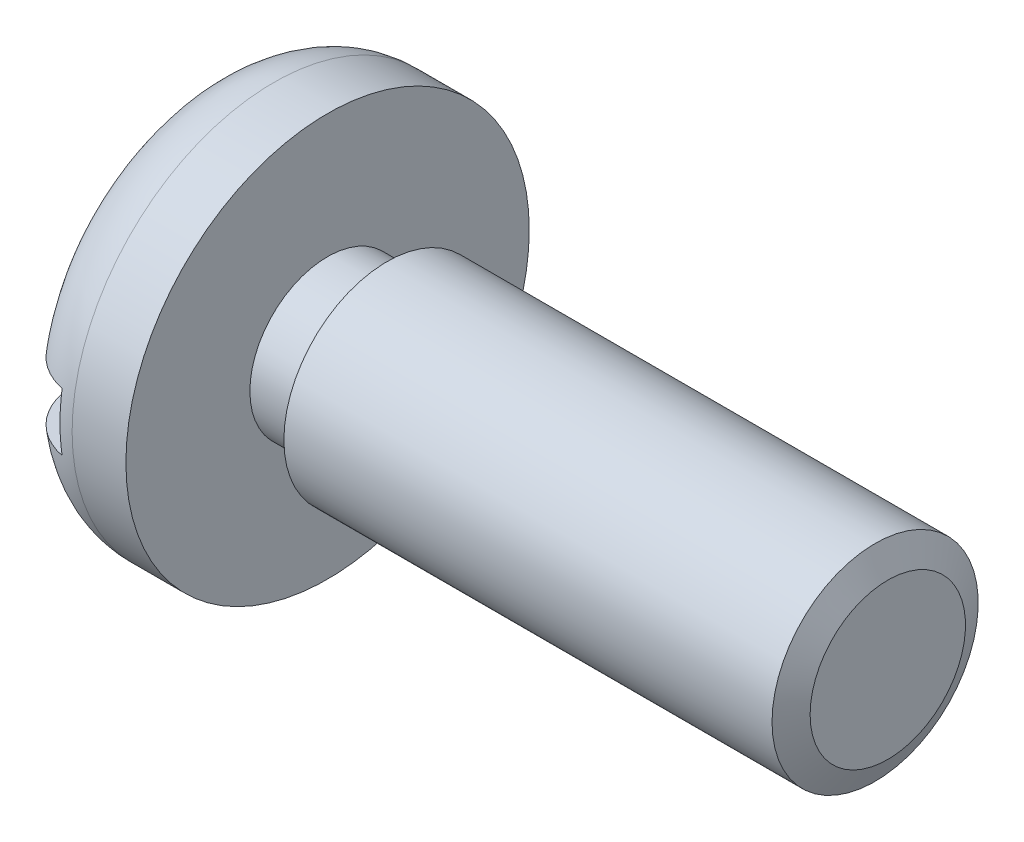
ISO-10303-21;
HEADER;
FILE_DESCRIPTION(('STEP AP214'),'2;1');
FILE_NAME('part.step','',(''),(''),'','','');
FILE_SCHEMA(('AUTOMOTIVE_DESIGN { 1 0 10303 214 1 1 1 1 }'));
ENDSEC;
DATA;
#1=APPLICATION_CONTEXT('core data for automotive mechanical design processes');
#2=APPLICATION_PROTOCOL_DEFINITION('international standard','automotive_design',2000,#1);
#3=PRODUCT_CONTEXT('',#1,'mechanical');
#4=PRODUCT('Part','Part','',(#3));
#5=PRODUCT_RELATED_PRODUCT_CATEGORY('part','',(#4));
#6=PRODUCT_DEFINITION_FORMATION('','',#4);
#7=PRODUCT_DEFINITION_CONTEXT('part definition',#1,'design');
#8=PRODUCT_DEFINITION('design','',#6,#7);
#9=PRODUCT_DEFINITION_SHAPE('','',#8);
#10=(LENGTH_UNIT() NAMED_UNIT(*) SI_UNIT(.MILLI.,.METRE.));
#11=(NAMED_UNIT(*) PLANE_ANGLE_UNIT() SI_UNIT($,.RADIAN.));
#12=(NAMED_UNIT(*) SI_UNIT($,.STERADIAN.) SOLID_ANGLE_UNIT());
#13=UNCERTAINTY_MEASURE_WITH_UNIT(LENGTH_MEASURE(1.E-05),#10,'distance_accuracy_value','');
#14=(GEOMETRIC_REPRESENTATION_CONTEXT(3) GLOBAL_UNCERTAINTY_ASSIGNED_CONTEXT((#13)) GLOBAL_UNIT_ASSIGNED_CONTEXT((#10,
#11,#12)) REPRESENTATION_CONTEXT('',''));
#15=CARTESIAN_POINT('',(0.,0.,0.));
#16=DIRECTION('',(0.,0.,1.));
#17=DIRECTION('',(1.,0.,0.));
#18=AXIS2_PLACEMENT_3D('',#15,#16,#17);
#19=CARTESIAN_POINT('',(-2.0828,2.2606,0.));
#20=DIRECTION('',(1.,0.,0.));
#21=DIRECTION('',(0.,0.,-1.));
#22=AXIS2_PLACEMENT_3D('',#19,#20,#21);
#23=PLANE('',#22);
#24=CARTESIAN_POINT('',(-2.0828,0.,0.));
#25=DIRECTION('',(-1.,0.,0.));
#26=DIRECTION('',(0.,0.,1.));
#27=AXIS2_PLACEMENT_3D('',#24,#25,#26);
#28=CIRCLE('',#27,2.2606);
#29=CARTESIAN_POINT('',(-2.0828,-0.4953,-2.20567229433567));
#30=VERTEX_POINT('',#29);
#31=CARTESIAN_POINT('',(-2.0828,-0.4953,2.20567229433567));
#32=VERTEX_POINT('',#31);
#33=EDGE_CURVE('E138',#30,#32,#28,.T.);
#34=ORIENTED_EDGE('',*,*,#33,.T.);
#35=DIRECTION('',(0.,0.,-1.));
#36=VECTOR('',#35,1.);
#37=CARTESIAN_POINT('',(-2.0828,-0.4953,0.));
#38=LINE('',#37,#36);
#39=EDGE_CURVE('E139',#32,#30,#38,.T.);
#40=ORIENTED_EDGE('',*,*,#39,.T.);
#41=EDGE_LOOP('',(#34,#40));
#42=FACE_BOUND('',#41,.T.);
#43=ADVANCED_FACE('F16',(#42),#23,.F.);
#44=CARTESIAN_POINT('',(-2.0828,0.4953,2.20567229433567));
#45=VERTEX_POINT('',#44);
#46=CARTESIAN_POINT('',(-2.0828,0.4953,-2.20567229433567));
#47=VERTEX_POINT('',#46);
#48=EDGE_CURVE('E83',#45,#47,#28,.T.);
#49=ORIENTED_EDGE('',*,*,#48,.T.);
#50=DIRECTION('',(0.,0.,1.));
#51=VECTOR('',#50,1.);
#52=CARTESIAN_POINT('',(-2.0828,0.4953,0.));
#53=LINE('',#52,#51);
#54=EDGE_CURVE('E77',#47,#45,#53,.T.);
#55=ORIENTED_EDGE('',*,*,#54,.T.);
#56=EDGE_LOOP('',(#49,#55));
#57=FACE_BOUND('',#56,.T.);
#58=ADVANCED_FACE('F18',(#57),#23,.F.);
#59=CARTESIAN_POINT('',(9.525,0.,0.));
#60=DIRECTION('',(-1.,0.,0.));
#61=DIRECTION('',(0.,0.,1.));
#62=AXIS2_PLACEMENT_3D('',#59,#60,#61);
#63=PLANE('',#62);
#64=CARTESIAN_POINT('',(9.525,0.,0.));
#65=DIRECTION('',(-1.,0.,0.));
#66=DIRECTION('',(0.,0.,1.));
#67=AXIS2_PLACEMENT_3D('',#64,#65,#66);
#68=CIRCLE('',#67,1.3208);
#69=CARTESIAN_POINT('',(9.525,0.,1.3208));
#70=VERTEX_POINT('',#69);
#71=EDGE_CURVE('E108',#70,#70,#68,.T.);
#72=ORIENTED_EDGE('',*,*,#71,.F.);
#73=EDGE_LOOP('',(#72));
#74=FACE_BOUND('',#73,.T.);
#75=ADVANCED_FACE('F249',(#74),#63,.F.);
#76=CARTESIAN_POINT('',(9.525,0.,0.));
#77=DIRECTION('',(-1.,0.,0.));
#78=DIRECTION('',(0.,0.,1.));
#79=AXIS2_PLACEMENT_3D('',#76,#77,#78);
#80=CONICAL_SURFACE('',#79,1.3208,1.10714871779409);
#81=CARTESIAN_POINT('',(9.3091,0.,0.));
#82=DIRECTION('',(-1.,0.,0.));
#83=DIRECTION('',(0.,0.,1.));
#84=AXIS2_PLACEMENT_3D('',#81,#82,#83);
#85=CIRCLE('',#84,1.7526);
#86=CARTESIAN_POINT('',(9.3091,0.,1.7526));
#87=VERTEX_POINT('',#86);
#88=EDGE_CURVE('E112',#87,#87,#85,.T.);
#89=ORIENTED_EDGE('',*,*,#88,.F.);
#90=EDGE_LOOP('',(#89));
#91=FACE_BOUND('',#90,.T.);
#92=ORIENTED_EDGE('',*,*,#71,.T.);
#93=EDGE_LOOP('',(#92));
#94=FACE_BOUND('',#93,.T.);
#95=ADVANCED_FACE('F238',(#91,#94),#80,.T.);
#96=CARTESIAN_POINT('',(-2.0828,0.,0.));
#97=DIRECTION('',(-1.,0.,0.));
#98=DIRECTION('',(0.,0.,1.));
#99=AXIS2_PLACEMENT_3D('',#96,#97,#98);
#100=CYLINDRICAL_SURFACE('',#99,1.7526);
#101=CARTESIAN_POINT('',(1.00965,0.,0.));
#102=DIRECTION('',(-1.,0.,0.));
#103=DIRECTION('',(0.,0.,1.));
#104=AXIS2_PLACEMENT_3D('',#101,#102,#103);
#105=CIRCLE('',#104,1.7526);
#106=CARTESIAN_POINT('',(1.00965,0.,1.7526));
#107=VERTEX_POINT('',#106);
#108=EDGE_CURVE('E116',#107,#107,#105,.T.);
#109=ORIENTED_EDGE('',*,*,#108,.F.);
#110=EDGE_LOOP('',(#109));
#111=FACE_BOUND('',#110,.T.);
#112=ORIENTED_EDGE('',*,*,#88,.T.);
#113=EDGE_LOOP('',(#112));
#114=FACE_BOUND('',#113,.T.);
#115=ADVANCED_FACE('F227',(#111,#114),#100,.T.);
#116=CARTESIAN_POINT('',(1.00965,0.,0.));
#117=DIRECTION('',(1.,0.,0.));
#118=DIRECTION('',(0.,0.,-1.));
#119=AXIS2_PLACEMENT_3D('',#116,#117,#118);
#120=CONICAL_SURFACE('',#119,1.7526,1.10714871779409);
#121=CARTESIAN_POINT('',(0.79375,0.,0.));
#122=DIRECTION('',(-1.,0.,0.));
#123=DIRECTION('',(0.,0.,1.));
#124=AXIS2_PLACEMENT_3D('',#121,#122,#123);
#125=CIRCLE('',#124,1.3208);
#126=CARTESIAN_POINT('',(0.79375,0.,1.3208));
#127=VERTEX_POINT('',#126);
#128=EDGE_CURVE('E120',#127,#127,#125,.T.);
#129=ORIENTED_EDGE('',*,*,#128,.F.);
#130=EDGE_LOOP('',(#129));
#131=FACE_BOUND('',#130,.T.);
#132=ORIENTED_EDGE('',*,*,#108,.T.);
#133=EDGE_LOOP('',(#132));
#134=FACE_BOUND('',#133,.T.);
#135=ADVANCED_FACE('F216',(#131,#134),#120,.T.);
#136=CARTESIAN_POINT('',(-2.0828,0.,0.));
#137=DIRECTION('',(-1.,0.,0.));
#138=DIRECTION('',(0.,0.,1.));
#139=AXIS2_PLACEMENT_3D('',#136,#137,#138);
#140=CYLINDRICAL_SURFACE('',#139,1.3208);
#141=CARTESIAN_POINT('',(0.,0.,0.));
#142=DIRECTION('',(-1.,0.,0.));
#143=DIRECTION('',(0.,0.,1.));
#144=AXIS2_PLACEMENT_3D('',#141,#142,#143);
#145=CIRCLE('',#144,1.3208);
#146=CARTESIAN_POINT('',(0.,0.,1.3208));
#147=VERTEX_POINT('',#146);
#148=EDGE_CURVE('E124',#147,#147,#145,.T.);
#149=ORIENTED_EDGE('',*,*,#148,.F.);
#150=EDGE_LOOP('',(#149));
#151=FACE_BOUND('',#150,.T.);
#152=ORIENTED_EDGE('',*,*,#128,.T.);
#153=EDGE_LOOP('',(#152));
#154=FACE_BOUND('',#153,.T.);
#155=ADVANCED_FACE('F205',(#151,#154),#140,.T.);
#156=CARTESIAN_POINT('',(0.,1.3208,0.));
#157=DIRECTION('',(-1.,0.,0.));
#158=DIRECTION('',(0.,0.,1.));
#159=AXIS2_PLACEMENT_3D('',#156,#157,#158);
#160=PLANE('',#159);
#161=CARTESIAN_POINT('',(0.,0.,0.));
#162=DIRECTION('',(-1.,0.,0.));
#163=DIRECTION('',(0.,0.,1.));
#164=AXIS2_PLACEMENT_3D('',#161,#162,#163);
#165=CIRCLE('',#164,3.429);
#166=CARTESIAN_POINT('',(0.,0.,3.429));
#167=VERTEX_POINT('',#166);
#168=EDGE_CURVE('E128',#167,#167,#165,.T.);
#169=ORIENTED_EDGE('',*,*,#168,.F.);
#170=EDGE_LOOP('',(#169));
#171=FACE_BOUND('',#170,.T.);
#172=ORIENTED_EDGE('',*,*,#148,.T.);
#173=EDGE_LOOP('',(#172));
#174=FACE_BOUND('',#173,.T.);
#175=ADVANCED_FACE('F195',(#171,#174),#160,.F.);
#176=CARTESIAN_POINT('',(-2.0828,0.,0.));
#177=DIRECTION('',(-1.,0.,0.));
#178=DIRECTION('',(0.,0.,1.));
#179=AXIS2_PLACEMENT_3D('',#176,#177,#178);
#180=CYLINDRICAL_SURFACE('',#179,3.429);
#181=CARTESIAN_POINT('',(-0.9144,0.,0.));
#182=DIRECTION('',(-1.,0.,0.));
#183=DIRECTION('',(0.,0.,1.));
#184=AXIS2_PLACEMENT_3D('',#181,#182,#183);
#185=CIRCLE('',#184,3.429);
#186=CARTESIAN_POINT('',(-0.9144,0.,3.429));
#187=VERTEX_POINT('',#186);
#188=EDGE_CURVE('E132',#187,#187,#185,.T.);
#189=ORIENTED_EDGE('',*,*,#188,.F.);
#190=EDGE_LOOP('',(#189));
#191=FACE_BOUND('',#190,.T.);
#192=ORIENTED_EDGE('',*,*,#168,.T.);
#193=EDGE_LOOP('',(#192));
#194=FACE_BOUND('',#193,.T.);
#195=ADVANCED_FACE('F186',(#191,#194),#180,.T.);
#196=CARTESIAN_POINT('',(-0.9144,0.,0.));
#197=DIRECTION('',(-1.,0.,0.));
#198=DIRECTION('',(0.,0.,1.));
#199=AXIS2_PLACEMENT_3D('',#196,#197,#198);
#200=TOROIDAL_SURFACE('',#199,2.2606,1.1684);
#201=CARTESIAN_POINT('',(-1.143,0.,0.));
#202=DIRECTION('',(1.,0.,0.));
#203=DIRECTION('',(0.,0.,-1.));
#204=AXIS2_PLACEMENT_3D('',#201,#202,#203);
#205=CIRCLE('',#204,3.40641874657382);
#206=CARTESIAN_POINT('',(-1.143,0.4953,3.37021758748743));
#207=VERTEX_POINT('',#206);
#208=CARTESIAN_POINT('',(-1.143,-0.4953,3.37021758748743));
#209=VERTEX_POINT('',#208);
#210=EDGE_CURVE('E62',#207,#209,#205,.T.);
#211=ORIENTED_EDGE('',*,*,#210,.T.);
#212=CARTESIAN_POINT('',(-1.25865842966259,-0.4953,1.03129456883617));
#213=CARTESIAN_POINT('',(-1.20231785172398,-0.4953,1.01202627526437));
#214=CARTESIAN_POINT('',(-1.14439336273882,-0.4953,0.99730839354669));
#215=CARTESIAN_POINT('',(-1.0268782932624,-0.4953,0.977833237836091));
#216=CARTESIAN_POINT('',(-0.967287663932715,-0.4953,0.973076256130951));
#217=CARTESIAN_POINT('',(-0.848148266979716,-0.4953,0.9738397546922));
#218=CARTESIAN_POINT('',(-0.788599524513452,-0.4953,0.979364216756958));
#219=CARTESIAN_POINT('',(-0.671279325053592,-0.4953,1.00033352543222));
#220=CARTESIAN_POINT('',(-0.613508401288207,-0.4953,1.01578131857541));
#221=CARTESIAN_POINT('',(-0.50106897853174,-0.4953,1.05577705679958));
#222=CARTESIAN_POINT('',(-0.446408830836591,-0.4953,1.08034827793362));
#223=CARTESIAN_POINT('',(-0.341475334021524,-0.4953,1.137522946039));
#224=CARTESIAN_POINT('',(-0.291203410896383,-0.4953,1.17012899093981));
#225=CARTESIAN_POINT('',(-0.191386732194814,-0.4953,1.24579532252149));
#226=CARTESIAN_POINT('',(-0.14237446705046,-0.4953,1.28955846690219));
#227=CARTESIAN_POINT('',(-0.0517434134905055,-0.4953,1.38416997676527));
#228=CARTESIAN_POINT('',(-0.0101271646327512,-0.4953,1.43502076526759));
#229=CARTESIAN_POINT('',(0.0675939365303478,-0.4953,1.54656045448974));
#230=CARTESIAN_POINT('',(0.103053230766098,-0.4953,1.60770082134308));
#231=CARTESIAN_POINT('',(0.163343892521421,-0.4953,1.73502115541));
#232=CARTESIAN_POINT('',(0.188174128743998,-0.4953,1.80120165818467));
#233=CARTESIAN_POINT('',(0.226609874407284,-0.4953,1.93756644226547));
#234=CARTESIAN_POINT('',(0.2400854386913,-0.4953,2.00778750188254));
#235=CARTESIAN_POINT('',(0.25476895343202,-0.4953,2.14950497901457));
#236=CARTESIAN_POINT('',(0.255978055484101,-0.4953,2.22100127617682));
#237=CARTESIAN_POINT('',(0.246033451749364,-0.4953,2.36154854028968));
#238=CARTESIAN_POINT('',(0.235151509053562,-0.4953,2.43061867937576));
#239=CARTESIAN_POINT('',(0.20162970301107,-0.4953,2.56584678694655));
#240=CARTESIAN_POINT('',(0.178991480261989,-0.4953,2.63200516037327));
#241=CARTESIAN_POINT('',(0.123257275380111,-0.4953,2.75770232097461));
#242=CARTESIAN_POINT('',(0.0904484407817019,-0.4953,2.8173684785767));
#243=CARTESIAN_POINT('',(0.0150850866751223,-0.4953,2.9301924334645));
#244=CARTESIAN_POINT('',(-0.0274683078214094,-0.4953,2.98335098096892));
#245=CARTESIAN_POINT('',(-0.12017978389927,-0.4953,3.08054182350319));
#246=CARTESIAN_POINT('',(-0.170169354902538,-0.4953,3.12473492512725));
#247=CARTESIAN_POINT('',(-0.276941416801732,-0.4953,3.2039681073496));
#248=CARTESIAN_POINT('',(-0.333723382963556,-0.4953,3.23900889432833));
#249=CARTESIAN_POINT('',(-0.451668070761293,-0.4953,3.29848311850365));
#250=CARTESIAN_POINT('',(-0.512764402464594,-0.4953,3.32304827094029));
#251=CARTESIAN_POINT('',(-0.638231701640182,-0.4953,3.36149038560763));
#252=CARTESIAN_POINT('',(-0.702602520490602,-0.4953,3.37536783246948));
#253=CARTESIAN_POINT('',(-0.832304446154914,-0.4953,3.39195984073498));
#254=CARTESIAN_POINT('',(-0.897625591166932,-0.4953,3.3947523659975));
#255=CARTESIAN_POINT('',(-1.0278057140246,-0.4953,3.38930718985754));
#256=CARTESIAN_POINT('',(-1.09266470091552,-0.4953,3.38106970493149));
#257=CARTESIAN_POINT('',(-1.21994725209916,-0.4953,3.35383632203645));
#258=CARTESIAN_POINT('',(-1.2823753866253,-0.4953,3.3348617697583));
#259=CARTESIAN_POINT('',(-1.40317234298728,-0.4953,3.28672917071923));
#260=CARTESIAN_POINT('',(-1.46154115084809,-0.4953,3.25757108890156));
#261=CARTESIAN_POINT('',(-1.57274776711267,-0.4953,3.1898300898739));
#262=CARTESIAN_POINT('',(-1.62556972105993,-0.4953,3.15122115397326));
#263=CARTESIAN_POINT('',(-1.72404354148637,-0.4953,3.06574645846064));
#264=CARTESIAN_POINT('',(-1.76969522919108,-0.4953,3.01888049303997));
#265=CARTESIAN_POINT('',(-1.85293279359619,-0.4953,2.9178445552637));
#266=CARTESIAN_POINT('',(-1.89045271085013,-0.4953,2.86362026187527));
#267=CARTESIAN_POINT('',(-1.95599552395073,-0.4953,2.74971094409342));
#268=CARTESIAN_POINT('',(-1.98401792634959,-0.4953,2.69002563617498));
#269=CARTESIAN_POINT('',(-2.03020275600156,-0.4953,2.56602885255314));
#270=CARTESIAN_POINT('',(-2.04822555372061,-0.4953,2.50166540125669));
#271=CARTESIAN_POINT('',(-2.07344084458097,-0.4953,2.37085453411824));
#272=CARTESIAN_POINT('',(-2.08063236615502,-0.4953,2.30440693187322));
#273=CARTESIAN_POINT('',(-2.08416031689963,-0.4953,2.16988030742554));
#274=CARTESIAN_POINT('',(-2.08027407068566,-0.4953,2.10179548816147));
#275=CARTESIAN_POINT('',(-2.06142351868867,-0.4953,1.96718334337168));
#276=CARTESIAN_POINT('',(-2.04645833428804,-0.4953,1.90065614180488));
#277=CARTESIAN_POINT('',(-2.00546569178942,-0.4953,1.76922971157659));
#278=CARTESIAN_POINT('',(-1.97916483735973,-0.4953,1.70441576303515));
#279=CARTESIAN_POINT('',(-1.91628004336839,-0.4953,1.5799538501817));
#280=CARTESIAN_POINT('',(-1.87969132168135,-0.4953,1.52030830521401));
#281=CARTESIAN_POINT('',(-1.79631579297794,-0.4953,1.40655575161628));
#282=CARTESIAN_POINT('',(-1.74931941907036,-0.4953,1.35260224363478));
#283=CARTESIAN_POINT('',(-1.64686385115651,-0.4953,1.25349009101257));
#284=CARTESIAN_POINT('',(-1.59141340794603,-0.4953,1.20832246089819));
#285=CARTESIAN_POINT('',(-1.49005019390923,-0.4953,1.13969634653527));
#286=CARTESIAN_POINT('',(-1.44583542881717,-0.4953,1.11370401733641));
#287=CARTESIAN_POINT('',(-1.35435622002262,-0.4953,1.06778611057227));
#288=CARTESIAN_POINT('',(-1.30709260253544,-0.4953,1.04785889770831));
#289=CARTESIAN_POINT('',(-1.25865842966259,-0.4953,1.03129456883617));
#290=B_SPLINE_CURVE_WITH_KNOTS('',3,(#212,#213,#214,#215,#216,#217,#218,#219,#220,#221,#222,
#223,#224,#225,#226,#227,#228,#229,#230,#231,#232,#233,#234,#235,#236,#237,#238,#239,#240,#241,
#242,#243,#244,#245,#246,#247,#248,#249,#250,#251,#252,#253,#254,#255,#256,#257,#258,#259,#260,
#261,#262,#263,#264,#265,#266,#267,#268,#269,#270,#271,#272,#273,#274,#275,#276,#277,#278,#279,
#280,#281,#282,#283,#284,#285,#286,#287,#288,#289),.UNSPECIFIED.,.T.,.F.,(4,2,2,2,2,2,2,2,2,2,2,
2,2,2,2,2,2,2,2,2,2,2,2,2,2,2,2,2,2,2,2,2,2,2,2,2,2,2,4),(0.,0.178460854177883,
0.356926944950474,0.535462166468205,0.714050424932531,0.893097470979752,1.07220248511093,
1.26849081505511,1.46484641452193,1.67589712449829,1.88697029194026,2.10042742514363,
2.31386451845951,2.52259964052087,2.73130564126556,2.93458632008537,3.13784354192637,
3.33704882575587,3.53623873027088,3.73284447409119,3.92944130235151,4.12465292496804,
4.31986071639144,4.51468178403546,4.70950352235657,4.90486776940296,5.10023688664502,
5.29713586181016,5.49404506538526,5.69363873743192,5.89325031199756,6.09690242334582,
6.30057068709934,6.50945305044677,6.71843266988182,6.93208094778175,7.14550956151248,
7.29896799940694,7.45238502455186),.UNSPECIFIED.);
#291=EDGE_CURVE('E11',#209,#32,#290,.T.);
#292=ORIENTED_EDGE('',*,*,#291,.T.);
#293=ORIENTED_EDGE('',*,*,#33,.F.);
#294=CARTESIAN_POINT('',(-1.69483173034929,-0.4953,-3.0906958049124));
#295=CARTESIAN_POINT('',(-1.64651679648159,-0.4953,-3.13460947418554));
#296=CARTESIAN_POINT('',(-1.59448271929782,-0.4953,-3.17449982798974));
#297=CARTESIAN_POINT('',(-1.48442016382644,-0.4953,-3.24502401174336));
#298=CARTESIAN_POINT('',(-1.42638500925761,-0.4953,-3.27564738010495));
#299=CARTESIAN_POINT('',(-1.30599388813425,-0.4953,-3.32668830222752));
#300=CARTESIAN_POINT('',(-1.24363878892937,-0.4953,-3.34710789795821));
#301=CARTESIAN_POINT('',(-1.11639313958097,-0.4953,-3.37713298789877));
#302=CARTESIAN_POINT('',(-1.05150320056214,-0.4953,-3.3867410722097));
#303=CARTESIAN_POINT('',(-0.921297292535715,-0.4953,-3.39485030581412));
#304=CARTESIAN_POINT('',(-0.855984113135854,-0.4953,-3.39339627861669));
#305=CARTESIAN_POINT('',(-0.726530361164131,-0.4953,-3.379530274905));
#306=CARTESIAN_POINT('',(-0.66238981221171,-0.4953,-3.36711807791598));
#307=CARTESIAN_POINT('',(-0.537171218311657,-0.4953,-3.33172204213842));
#308=CARTESIAN_POINT('',(-0.476089958944339,-0.4953,-3.30874956898308));
#309=CARTESIAN_POINT('',(-0.358631959792884,-0.4953,-3.25291244341818));
#310=CARTESIAN_POINT('',(-0.30225524709228,-0.4953,-3.22004773406518));
#311=CARTESIAN_POINT('',(-0.195569926963902,-0.4953,-3.14524574312156));
#312=CARTESIAN_POINT('',(-0.145284646589871,-0.4953,-3.10327520236686));
#313=CARTESIAN_POINT('',(-0.0523996653020235,-0.4953,-3.01155473505763));
#314=CARTESIAN_POINT('',(-0.00980018622980632,-0.4953,-2.96180458403116));
#315=CARTESIAN_POINT('',(0.066927497189134,-0.4953,-2.85547909119013));
#316=CARTESIAN_POINT('',(0.100977152266624,-0.4953,-2.79884708711212));
#317=CARTESIAN_POINT('',(0.159241692299233,-0.4953,-2.68073552947152));
#318=CARTESIAN_POINT('',(0.1834560218155,-0.4953,-2.61925570236768));
#319=CARTESIAN_POINT('',(0.221772009222075,-0.4953,-2.49222637147104));
#320=CARTESIAN_POINT('',(0.235718110358088,-0.4953,-2.42662998159779));
#321=CARTESIAN_POINT('',(0.252647604884612,-0.4953,-2.29404117968433));
#322=CARTESIAN_POINT('',(0.255629944924296,-0.4953,-2.2270486341293));
#323=CARTESIAN_POINT('',(0.250637668494959,-0.4953,-2.09203352857082));
#324=CARTESIAN_POINT('',(0.242426246659937,-0.4953,-2.02401976590004));
#325=CARTESIAN_POINT('',(0.215001209948225,-0.4953,-1.8902510157398));
#326=CARTESIAN_POINT('',(0.195786228600201,-0.4953,-1.82449630986536));
#327=CARTESIAN_POINT('',(0.146351034527956,-0.4953,-1.69528529783463));
#328=CARTESIAN_POINT('',(0.115856287506141,-0.4953,-1.63193399463439));
#329=CARTESIAN_POINT('',(0.0448552963245588,-0.4953,-1.51109996234073));
#330=CARTESIAN_POINT('',(0.00434659763196348,-0.4953,-1.45361867694365));
#331=CARTESIAN_POINT('',(-0.0864441161336933,-0.4953,-1.3451345647684));
#332=CARTESIAN_POINT('',(-0.136892503958916,-0.4953,-1.29427067065176));
#333=CARTESIAN_POINT('',(-0.245811831832139,-0.4953,-1.20195412103746));
#334=CARTESIAN_POINT('',(-0.304283760052612,-0.4953,-1.16050262643496));
#335=CARTESIAN_POINT('',(-0.42618776270175,-0.4953,-1.08970485692686));
#336=CARTESIAN_POINT('',(-0.489454973943129,-0.4953,-1.06007640251779));
#337=CARTESIAN_POINT('',(-0.620393447679249,-0.4953,-1.01317063298784));
#338=CARTESIAN_POINT('',(-0.688059329261731,-0.4953,-0.995878525833574));
#339=CARTESIAN_POINT('',(-0.81883765657131,-0.4953,-0.975947197580796));
#340=CARTESIAN_POINT('',(-0.881759790118729,-0.4953,-0.972055537570282));
#341=CARTESIAN_POINT('',(-1.00726551726441,-0.4953,-0.975688465922141));
#342=CARTESIAN_POINT('',(-1.06984918168174,-0.4953,-0.983210565445861));
#343=CARTESIAN_POINT('',(-1.18885048758372,-0.4953,-1.00830640806627));
#344=CARTESIAN_POINT('',(-1.24540927368257,-0.4953,-1.02522411164615));
#345=CARTESIAN_POINT('',(-1.35517080117943,-0.4953,-1.06771180075613));
#346=CARTESIAN_POINT('',(-1.40837246739843,-0.4953,-1.09328454170092));
#347=CARTESIAN_POINT('',(-1.51379658921245,-0.4953,-1.15404250252507));
#348=CARTESIAN_POINT('',(-1.5657122217531,-0.4953,-1.18975878282889));
#349=CARTESIAN_POINT('',(-1.66349753856407,-0.4953,-1.26867707523791));
#350=CARTESIAN_POINT('',(-1.70936510832355,-0.4953,-1.31188169324577));
#351=CARTESIAN_POINT('',(-1.79821929190491,-0.4953,-1.40907659116422));
#352=CARTESIAN_POINT('',(-1.84051213985763,-0.4953,-1.46370293248686));
#353=CARTESIAN_POINT('',(-1.91571722413158,-0.4953,-1.57907800401892));
#354=CARTESIAN_POINT('',(-1.94862728889868,-0.4953,-1.63982814712641));
#355=CARTESIAN_POINT('',(-2.00515040079811,-0.4953,-1.76815421209215));
#356=CARTESIAN_POINT('',(-2.02838556787471,-0.4953,-1.83589724229477));
#357=CARTESIAN_POINT('',(-2.06298882435397,-0.4953,-1.97435146298239));
#358=CARTESIAN_POINT('',(-2.07435781096079,-0.4953,-2.04506242864064));
#359=CARTESIAN_POINT('',(-2.08465998636863,-0.4953,-2.18646291687755));
#360=CARTESIAN_POINT('',(-2.08375348814245,-0.4953,-2.25714068274693));
#361=CARTESIAN_POINT('',(-2.06974720831003,-0.4953,-2.39730132042416));
#362=CARTESIAN_POINT('',(-2.05664585027372,-0.4953,-2.46678403656514));
#363=CARTESIAN_POINT('',(-2.0190008723784,-0.4953,-2.60061937347771));
#364=CARTESIAN_POINT('',(-1.99476383398078,-0.4953,-2.66505843468401));
#365=CARTESIAN_POINT('',(-1.93557857001175,-0.4953,-2.78874636156318));
#366=CARTESIAN_POINT('',(-1.90064541875711,-0.4953,-2.84800238168622));
#367=CARTESIAN_POINT('',(-1.83662057069832,-0.4953,-2.93774368015431));
#368=CARTESIAN_POINT('',(-1.81056454681844,-0.4953,-2.97043629314872));
#369=CARTESIAN_POINT('',(-1.75512353612907,-0.4953,-3.03286664299465));
#370=CARTESIAN_POINT('',(-1.72573858985191,-0.4953,-3.06260441581547));
#371=CARTESIAN_POINT('',(-1.69483173034929,-0.4953,-3.0906958049124));
#372=B_SPLINE_CURVE_WITH_KNOTS('',3,(#294,#295,#296,#297,#298,#299,#300,#301,#302,#303,#304,
#305,#306,#307,#308,#309,#310,#311,#312,#313,#314,#315,#316,#317,#318,#319,#320,#321,#322,#323,
#324,#325,#326,#327,#328,#329,#330,#331,#332,#333,#334,#335,#336,#337,#338,#339,#340,#341,#342,
#343,#344,#345,#346,#347,#348,#349,#350,#351,#352,#353,#354,#355,#356,#357,#358,#359,#360,#361,
#362,#363,#364,#365,#366,#367,#368,#369,#370,#371),.UNSPECIFIED.,.T.,.F.,(4,2,2,2,2,2,2,2,2,2,2,
2,2,2,2,2,2,2,2,2,2,2,2,2,2,2,2,2,2,2,2,2,2,2,2,2,2,2,4),(0.,0.195717765464168,
0.391655661319844,0.587554330543242,0.783406058554632,0.978464622247913,1.17352711054466,
1.36838015008409,1.56323431129258,1.75881253518255,1.95439640330472,2.15171631843602,
2.34904737543682,2.54930959612754,2.74959105664499,2.95417589844182,3.15878615201242,
3.36874465447002,3.57875467124778,3.79263542409434,4.0065425419959,4.21498538724006,
4.42317787478347,4.61128965143673,4.79936041508429,4.97570364531483,5.15210306900608,
5.34037322915417,5.52870903836979,5.73503594607647,5.94141056745155,6.15522415510053,
6.3690215750923,6.58002960840309,6.7910649225204,6.99660938218275,7.20186548560714,
7.32706683930607,7.45226666874043),.UNSPECIFIED.);
#373=CARTESIAN_POINT('',(-1.143,-0.4953,-3.37021758748743));
#374=VERTEX_POINT('',#373);
#375=EDGE_CURVE('E44',#30,#374,#372,.T.);
#376=ORIENTED_EDGE('',*,*,#375,.T.);
#377=CARTESIAN_POINT('',(-1.143,0.4953,-3.37021758748743));
#378=VERTEX_POINT('',#377);
#379=EDGE_CURVE('E69',#374,#378,#205,.T.);
#380=ORIENTED_EDGE('',*,*,#379,.T.);
#381=CARTESIAN_POINT('',(-1.69483173034929,0.4953,-3.0906958049124));
#382=CARTESIAN_POINT('',(-1.74398923927635,0.4953,-3.04600800839749));
#383=CARTESIAN_POINT('',(-1.78937124311078,0.4953,-2.99708523658167));
#384=CARTESIAN_POINT('',(-1.87127228019071,0.4953,-2.89224123676695));
#385=CARTESIAN_POINT('',(-1.90777881046528,0.4953,-2.83631030234295));
#386=CARTESIAN_POINT('',(-1.97087631249051,0.4953,-2.71919456962705));
#387=CARTESIAN_POINT('',(-1.99747907408158,0.4953,-2.65801612567047));
#388=CARTESIAN_POINT('',(-2.04017436108254,0.4953,-2.53212307781289));
#389=CARTESIAN_POINT('',(-2.05626964588,0.4953,-2.46740940714581));
#390=CARTESIAN_POINT('',(-2.07778753508986,0.4953,-2.33535006884342));
#391=CARTESIAN_POINT('',(-2.0830652501149,0.4953,-2.26798083500878));
#392=CARTESIAN_POINT('',(-2.08251407283771,0.4953,-2.1332880179516));
#393=CARTESIAN_POINT('',(-2.07668343150694,0.4953,-2.06596444358784));
#394=CARTESIAN_POINT('',(-2.05394499185464,0.4953,-1.93155836664986));
#395=CARTESIAN_POINT('',(-2.03677551957315,0.4953,-1.86452016505533));
#396=CARTESIAN_POINT('',(-1.99171169829125,0.4953,-1.73415242944129));
#397=CARTESIAN_POINT('',(-1.9638159169573,0.4953,-1.67082339202558));
#398=CARTESIAN_POINT('',(-1.89728594529236,0.4953,-1.54796968423181));
#399=CARTESIAN_POINT('',(-1.85839535748937,0.4953,-1.48858373945755));
#400=CARTESIAN_POINT('',(-1.7712604776927,0.4953,-1.37708718235927));
#401=CARTESIAN_POINT('',(-1.72301301230266,0.4953,-1.32497904865655));
#402=CARTESIAN_POINT('',(-1.61801466563302,0.4953,-1.22934590644485));
#403=CARTESIAN_POINT('',(-1.56120765874242,0.4953,-1.18588230469797));
#404=CARTESIAN_POINT('',(-1.44075788315117,0.4953,-1.109736405657));
#405=CARTESIAN_POINT('',(-1.37711799766179,0.4953,-1.0770495844939));
#406=CARTESIAN_POINT('',(-1.24846319785388,0.4953,-1.02573336004812));
#407=CARTESIAN_POINT('',(-1.18372163667581,0.4953,-1.00642320425005));
#408=CARTESIAN_POINT('',(-1.05178062991051,0.4953,-0.980382065653736));
#409=CARTESIAN_POINT('',(-0.98458396180554,0.4953,-0.973637290961325));
#410=CARTESIAN_POINT('',(-0.857095196169164,0.4953,-0.973264597209398));
#411=CARTESIAN_POINT('',(-0.796803309335612,0.4953,-0.978359752039479));
#412=CARTESIAN_POINT('',(-0.677965828847794,0.4953,-0.998730631603534));
#413=CARTESIAN_POINT('',(-0.619420604930683,0.4953,-1.01400849608191));
#414=CARTESIAN_POINT('',(-0.506196138810764,0.4953,-1.05365459271847));
#415=CARTESIAN_POINT('',(-0.451483661483388,0.4953,-1.07792888926608));
#416=CARTESIAN_POINT('',(-0.346402943199056,0.4953,-1.13452346005755));
#417=CARTESIAN_POINT('',(-0.296035997503041,0.4953,-1.16684612217634));
#418=CARTESIAN_POINT('',(-0.195994309074845,0.4953,-1.24192337784048));
#419=CARTESIAN_POINT('',(-0.146846067012434,0.4953,-1.28537985740457));
#420=CARTESIAN_POINT('',(-0.0558890873421211,0.4953,-1.37939690324556));
#421=CARTESIAN_POINT('',(-0.014082949566309,0.4953,-1.42995997459592));
#422=CARTESIAN_POINT('',(0.0641245636961778,0.4953,-1.54097962070077));
#423=CARTESIAN_POINT('',(0.0998761666327095,0.4953,-1.60189558465544));
#424=CARTESIAN_POINT('',(0.160794454744749,0.4953,-1.72881476688285));
#425=CARTESIAN_POINT('',(0.185959993735422,0.4953,-1.79481853511242));
#426=CARTESIAN_POINT('',(0.225124121057545,0.4953,-1.93094180050333));
#427=CARTESIAN_POINT('',(0.238983428827412,0.4953,-2.00110153604909));
#428=CARTESIAN_POINT('',(0.254442569186012,0.4953,-2.14276325260476));
#429=CARTESIAN_POINT('',(0.256043518547163,0.4953,-2.21426511074838));
#430=CARTESIAN_POINT('',(0.246868918163507,0.4953,-2.35490864897597));
#431=CARTESIAN_POINT('',(0.236362252758043,0.4953,-2.42406781038602));
#432=CARTESIAN_POINT('',(0.20356933745182,0.4953,-2.55953710059799));
#433=CARTESIAN_POINT('',(0.181284746609189,0.4953,-2.62584762924092));
#434=CARTESIAN_POINT('',(0.126217331289171,0.4953,-2.75189952342385));
#435=CARTESIAN_POINT('',(0.0937231123825091,0.4953,-2.81176701829552));
#436=CARTESIAN_POINT('',(0.0189486079584515,0.4953,-2.92504385501691));
#437=CARTESIAN_POINT('',(-0.0233305618953068,0.4953,-2.97845393207438));
#438=CARTESIAN_POINT('',(-0.115542117919828,0.4953,-3.07617867554041));
#439=CARTESIAN_POINT('',(-0.165304051798068,0.4953,-3.12065424062245));
#440=CARTESIAN_POINT('',(-0.271673028267289,0.4953,-3.20048600936425));
#441=CARTESIAN_POINT('',(-0.328279553396339,0.4953,-3.23584290177771));
#442=CARTESIAN_POINT('',(-0.445927591012314,0.4953,-3.29596627010681));
#443=CARTESIAN_POINT('',(-0.506901549250879,0.4953,-3.32086499078952));
#444=CARTESIAN_POINT('',(-0.63217999828044,0.4953,-3.35998797907013));
#445=CARTESIAN_POINT('',(-0.696484193628009,0.4953,-3.37421319184463));
#446=CARTESIAN_POINT('',(-0.826099733884119,0.4953,-3.39150193426309));
#447=CARTESIAN_POINT('',(-0.891400408984534,0.4953,-3.39464557051434));
#448=CARTESIAN_POINT('',(-1.02161809494976,0.4953,-3.38989977034934));
#449=CARTESIAN_POINT('',(-1.08653500643506,0.4953,-3.38200759184834));
#450=CARTESIAN_POINT('',(-1.21401181886348,0.4953,-3.35544560241229));
#451=CARTESIAN_POINT('',(-1.27657520855749,0.4953,-3.33679247241765));
#452=CARTESIAN_POINT('',(-1.39763397574957,0.4953,-3.28928192060423));
#453=CARTESIAN_POINT('',(-1.45613449546991,0.4953,-3.26043768968396));
#454=CARTESIAN_POINT('',(-1.54442808979492,0.4953,-3.20730081679939));
#455=CARTESIAN_POINT('',(-1.57609388438595,0.4953,-3.18605328988412));
#456=CARTESIAN_POINT('',(-1.6371977324102,0.4953,-3.14056686537812));
#457=CARTESIAN_POINT('',(-1.66663579808582,0.4953,-3.11632798422821));
#458=CARTESIAN_POINT('',(-1.69483173034929,0.4953,-3.0906958049124));
#459=B_SPLINE_CURVE_WITH_KNOTS('',3,(#381,#382,#383,#384,#385,#386,#387,#388,#389,#390,#391,
#392,#393,#394,#395,#396,#397,#398,#399,#400,#401,#402,#403,#404,#405,#406,#407,#408,#409,#410,
#411,#412,#413,#414,#415,#416,#417,#418,#419,#420,#421,#422,#423,#424,#425,#426,#427,#428,#429,
#430,#431,#432,#433,#434,#435,#436,#437,#438,#439,#440,#441,#442,#443,#444,#445,#446,#447,#448,
#449,#450,#451,#452,#453,#454,#455,#456,#457,#458),.UNSPECIFIED.,.T.,.F.,(4,2,2,2,2,2,2,2,2,2,2,
2,2,2,2,2,2,2,2,2,2,2,2,2,2,2,2,2,2,2,2,2,2,2,2,2,2,2,4),(0.,0.199159686879055,
0.398598327212943,0.597798782848031,0.796946905023421,0.998745413039181,1.20057569717972,
1.40723459275718,1.61392109403921,1.82589379685803,2.03793851659629,2.25143955827497,
2.46485086219359,2.66639226270835,2.86771231863696,3.0483402588947,3.22900616738923,
3.4078365024083,3.58671995807005,3.78270474864877,3.97875879794065,4.1896718833559,
4.40060779908818,4.61410456447701,4.82758187945263,5.03640820785633,5.24520512847353,
5.44856281399589,5.65189732443021,5.85115478275785,6.05039718631402,6.24703821520766,
6.44366182879183,6.63886113949932,6.83410896027912,7.02905493050473,7.22374949037643,
7.33798481323159,7.45221950826434),.UNSPECIFIED.);
#460=EDGE_CURVE('E74',#378,#47,#459,.T.);
#461=ORIENTED_EDGE('',*,*,#460,.T.);
#462=ORIENTED_EDGE('',*,*,#48,.F.);
#463=CARTESIAN_POINT('',(-1.25865842966259,0.4953,1.03129456883617));
#464=CARTESIAN_POINT('',(-1.32994365235602,0.4953,1.05568178049233));
#465=CARTESIAN_POINT('',(-1.39884808504352,0.4953,1.08742045176232));
#466=CARTESIAN_POINT('',(-1.529468110826,0.4953,1.16347930965426));
#467=CARTESIAN_POINT('',(-1.591159184088,0.4953,1.20784074456799));
#468=CARTESIAN_POINT('',(-1.6981664696959,0.4953,1.30068489943957));
#469=CARTESIAN_POINT('',(-1.74456737292445,0.4953,1.34792652549167));
#470=CARTESIAN_POINT('',(-1.82939958304374,0.4953,1.44899614442538));
#471=CARTESIAN_POINT('',(-1.86783977313728,0.4953,1.50281668816221));
#472=CARTESIAN_POINT('',(-1.93849316498946,0.4953,1.62003647798111));
#473=CARTESIAN_POINT('',(-1.97001838965712,0.4953,1.68385197051459));
#474=CARTESIAN_POINT('',(-2.0219374412546,0.4953,1.81589124159411));
#475=CARTESIAN_POINT('',(-2.04232706752784,0.4953,1.88411667285284));
#476=CARTESIAN_POINT('',(-2.07124671147554,0.4953,2.02311562069078));
#477=CARTESIAN_POINT('',(-2.07976527215108,0.4953,2.0938915313169));
#478=CARTESIAN_POINT('',(-2.08447924040992,0.4953,2.2358531612361));
#479=CARTESIAN_POINT('',(-2.08067660856842,0.4953,2.30703881353086));
#480=CARTESIAN_POINT('',(-2.06094545521978,0.4953,2.44593254973031));
#481=CARTESIAN_POINT('',(-2.04531611038663,0.4953,2.51368310501839));
#482=CARTESIAN_POINT('',(-2.00260906726764,0.4953,2.64547663980761));
#483=CARTESIAN_POINT('',(-1.97553295287731,0.4953,2.7095201308638));
#484=CARTESIAN_POINT('',(-1.91145864327231,0.4953,2.83037539408674));
#485=CARTESIAN_POINT('',(-1.87472672553541,0.4953,2.88732839665861));
#486=CARTESIAN_POINT('',(-1.79205394067107,0.4953,2.99410601898959));
#487=CARTESIAN_POINT('',(-1.74611403313723,0.4953,3.04393138061613));
#488=CARTESIAN_POINT('',(-1.64726023130273,0.4953,3.13408033431096));
#489=CARTESIAN_POINT('',(-1.59449084946899,0.4953,3.17456245393879));
#490=CARTESIAN_POINT('',(-1.48283883835403,0.4953,3.24596840821411));
#491=CARTESIAN_POINT('',(-1.42395664833869,0.4953,3.27689292903558));
#492=CARTESIAN_POINT('',(-1.30249589935193,0.4953,3.32794585755657));
#493=CARTESIAN_POINT('',(-1.23996854072946,0.4953,3.34819613296357));
#494=CARTESIAN_POINT('',(-1.11239157112953,0.4953,3.37784125437136));
#495=CARTESIAN_POINT('',(-1.04734205893462,0.4953,3.38723652507577));
#496=CARTESIAN_POINT('',(-0.916982661944303,0.4953,3.3948680996185));
#497=CARTESIAN_POINT('',(-0.851676644730639,0.4953,3.39317063152325));
#498=CARTESIAN_POINT('',(-0.722279969175525,0.4953,3.37882315814441));
#499=CARTESIAN_POINT('',(-0.658189292691638,0.4953,3.36617331648803));
#500=CARTESIAN_POINT('',(-0.533105181164652,0.4953,3.33031375589344));
#501=CARTESIAN_POINT('',(-0.472108687445389,0.4953,3.30711470050232));
#502=CARTESIAN_POINT('',(-0.354856498356161,0.4953,3.25084229161159));
#503=CARTESIAN_POINT('',(-0.298600839098602,0.4953,3.21776886290453));
#504=CARTESIAN_POINT('',(-0.192187869053801,0.4953,3.14257054005347));
#505=CARTESIAN_POINT('',(-0.142054335982718,0.4953,3.10041200897654));
#506=CARTESIAN_POINT('',(-0.0495014041334231,0.4953,3.00834382351483));
#507=CARTESIAN_POINT('',(-0.00708224219815178,0.4953,2.95843393123865));
#508=CARTESIAN_POINT('',(0.0692623718184169,0.4953,2.85181702358833));
#509=CARTESIAN_POINT('',(0.103108531612594,0.4953,2.7950532511892));
#510=CARTESIAN_POINT('',(0.160947834498952,0.4953,2.67671395835948));
#511=CARTESIAN_POINT('',(0.184940423174957,0.4953,2.61513816741018));
#512=CARTESIAN_POINT('',(0.222799349969533,0.4953,2.4879491090118));
#513=CARTESIAN_POINT('',(0.236509203677742,0.4953,2.42228929743635));
#514=CARTESIAN_POINT('',(0.252959827984735,0.4953,2.28961338427548));
#515=CARTESIAN_POINT('',(0.255699546142241,0.4953,2.22259715317915));
#516=CARTESIAN_POINT('',(0.250217049680733,0.4953,2.08756935290383));
#517=CARTESIAN_POINT('',(0.24175724539157,0.4953,2.0195674716802));
#518=CARTESIAN_POINT('',(0.213840949597521,0.4953,1.88586276434154));
#519=CARTESIAN_POINT('',(0.194383081913279,0.4953,1.82016022703444));
#520=CARTESIAN_POINT('',(0.144466887213134,0.4953,1.69109357863213));
#521=CARTESIAN_POINT('',(0.113734234448992,0.4953,1.62783552859277));
#522=CARTESIAN_POINT('',(0.042273393981301,0.4953,1.50722652653279));
#523=CARTESIAN_POINT('',(0.00154264223532447,0.4953,1.44987709515984));
#524=CARTESIAN_POINT('',(-0.0896669332743825,0.4953,1.34170939383827));
#525=CARTESIAN_POINT('',(-0.140309946349149,0.4953,1.2910292649805));
#526=CARTESIAN_POINT('',(-0.249586225847838,0.4953,1.1991234314075));
#527=CARTESIAN_POINT('',(-0.308219795335649,0.4953,1.15789808545016));
#528=CARTESIAN_POINT('',(-0.430348861316456,0.4953,1.08761977453548));
#529=CARTESIAN_POINT('',(-0.493674562131021,0.4953,1.0582734687912));
#530=CARTESIAN_POINT('',(-0.624707482925292,0.4953,1.01193504403482));
#531=CARTESIAN_POINT('',(-0.69241117358376,0.4953,0.994933105544308));
#532=CARTESIAN_POINT('',(-0.823204074967344,0.4953,0.975554490255672));
#533=CARTESIAN_POINT('',(-0.886109697640029,0.4953,0.971926937522924));
#534=CARTESIAN_POINT('',(-1.01146336225208,0.4953,0.976081844413315));
#535=CARTESIAN_POINT('',(-1.07391206387841,0.4953,0.983841710447878));
#536=CARTESIAN_POINT('',(-1.15602100439673,0.4953,1.00147043844228));
#537=CARTESIAN_POINT('',(-1.17679069191799,0.4953,1.00658954936711));
#538=CARTESIAN_POINT('',(-1.21799033170586,0.4953,1.01803988974244));
#539=CARTESIAN_POINT('',(-1.23842032773535,0.4953,1.02437096171859));
#540=CARTESIAN_POINT('',(-1.25865842966259,0.4953,1.03129456883617));
#541=B_SPLINE_CURVE_WITH_KNOTS('',3,(#463,#464,#465,#466,#467,#468,#469,#470,#471,#472,#473,
#474,#475,#476,#477,#478,#479,#480,#481,#482,#483,#484,#485,#486,#487,#488,#489,#490,#491,#492,
#493,#494,#495,#496,#497,#498,#499,#500,#501,#502,#503,#504,#505,#506,#507,#508,#509,#510,#511,
#512,#513,#514,#515,#516,#517,#518,#519,#520,#521,#522,#523,#524,#525,#526,#527,#528,#529,#530,
#531,#532,#533,#534,#535,#536,#537,#538,#539,#540),.UNSPECIFIED.,.T.,.F.,(4,2,2,2,2,2,2,2,2,2,2,
2,2,2,2,2,2,2,2,2,2,2,2,2,2,2,2,2,2,2,2,2,2,2,2,2,2,2,4),(0.,0.225918648261452,
0.452584196249846,0.650431048203005,0.8480559228037,1.06058045620393,1.27318510447568,
1.48599479990303,1.6987706342478,1.9063367468231,2.11387414776195,2.31619914017238,
2.51850305861112,2.71706970159464,2.91562208545994,3.11185561590059,3.30808146841619,
3.5031368492763,3.69818931608121,3.89304505321636,4.08790227449393,4.28349373066285,
4.4790911907739,4.67643662050359,4.8737931524532,5.07409533324275,5.274416729951,
5.47905663809184,5.68372215834022,5.89373905591329,6.10380986932183,6.31771073450611,
6.53161971472964,6.73986603496932,6.94794652108682,7.1359864009525,7.32365369807764,
7.38780105162072,7.45194007592374),.UNSPECIFIED.);
#542=EDGE_CURVE('E29',#45,#207,#541,.T.);
#543=ORIENTED_EDGE('',*,*,#542,.T.);
#544=EDGE_LOOP('',(#211,#292,#293,#376,#380,#461,#462,#543));
#545=FACE_BOUND('',#544,.T.);
#546=ORIENTED_EDGE('',*,*,#188,.T.);
#547=EDGE_LOOP('',(#546));
#548=FACE_BOUND('',#547,.T.);
#549=ADVANCED_FACE('F80',(#545,#548),#200,.T.);
#550=CARTESIAN_POINT('',(-2.1129,-0.4953,-3.529));
#551=DIRECTION('',(0.,-1.,0.));
#552=DIRECTION('',(0.,0.,-1.));
#553=AXIS2_PLACEMENT_3D('',#550,#551,#552);
#554=PLANE('',#553);
#555=ORIENTED_EDGE('',*,*,#39,.F.);
#556=ORIENTED_EDGE('',*,*,#291,.F.);
#557=DIRECTION('',(0.,0.,1.));
#558=VECTOR('',#557,1.);
#559=CARTESIAN_POINT('',(-1.143,-0.4953,-3.529));
#560=LINE('',#559,#558);
#561=EDGE_CURVE('E64',#374,#209,#560,.T.);
#562=ORIENTED_EDGE('',*,*,#561,.F.);
#563=ORIENTED_EDGE('',*,*,#375,.F.);
#564=EDGE_LOOP('',(#555,#556,#562,#563));
#565=FACE_BOUND('',#564,.T.);
#566=ADVANCED_FACE('F101',(#565),#554,.F.);
#567=CARTESIAN_POINT('',(-2.1129,0.4953,-3.529));
#568=DIRECTION('',(0.,1.,0.));
#569=DIRECTION('',(0.,0.,1.));
#570=AXIS2_PLACEMENT_3D('',#567,#568,#569);
#571=PLANE('',#570);
#572=DIRECTION('',(0.,0.,1.));
#573=VECTOR('',#572,1.);
#574=CARTESIAN_POINT('',(-1.143,0.4953,-3.529));
#575=LINE('',#574,#573);
#576=EDGE_CURVE('E36',#378,#207,#575,.T.);
#577=ORIENTED_EDGE('',*,*,#576,.T.);
#578=ORIENTED_EDGE('',*,*,#542,.F.);
#579=ORIENTED_EDGE('',*,*,#54,.F.);
#580=ORIENTED_EDGE('',*,*,#460,.F.);
#581=EDGE_LOOP('',(#577,#578,#579,#580));
#582=FACE_BOUND('',#581,.T.);
#583=ADVANCED_FACE('F71',(#582),#571,.F.);
#584=CARTESIAN_POINT('',(-1.143,0.,-3.529));
#585=DIRECTION('',(1.,0.,0.));
#586=DIRECTION('',(0.,0.,-1.));
#587=AXIS2_PLACEMENT_3D('',#584,#585,#586);
#588=PLANE('',#587);
#589=ORIENTED_EDGE('',*,*,#576,.F.);
#590=ORIENTED_EDGE('',*,*,#379,.F.);
#591=ORIENTED_EDGE('',*,*,#561,.T.);
#592=ORIENTED_EDGE('',*,*,#210,.F.);
#593=EDGE_LOOP('',(#589,#590,#591,#592));
#594=FACE_BOUND('',#593,.T.);
#595=ADVANCED_FACE('F63',(#594),#588,.F.);
#596=CLOSED_SHELL('',(#43,#58,#75,#95,#115,#135,#155,#175,#195,#549,#566,#583,#595));
#597=MANIFOLD_SOLID_BREP('B1',#596);
#598=ADVANCED_BREP_SHAPE_REPRESENTATION('',(#18,#597),#14);
#599=SHAPE_DEFINITION_REPRESENTATION(#9,#598);
ENDSEC;
END-ISO-10303-21;
